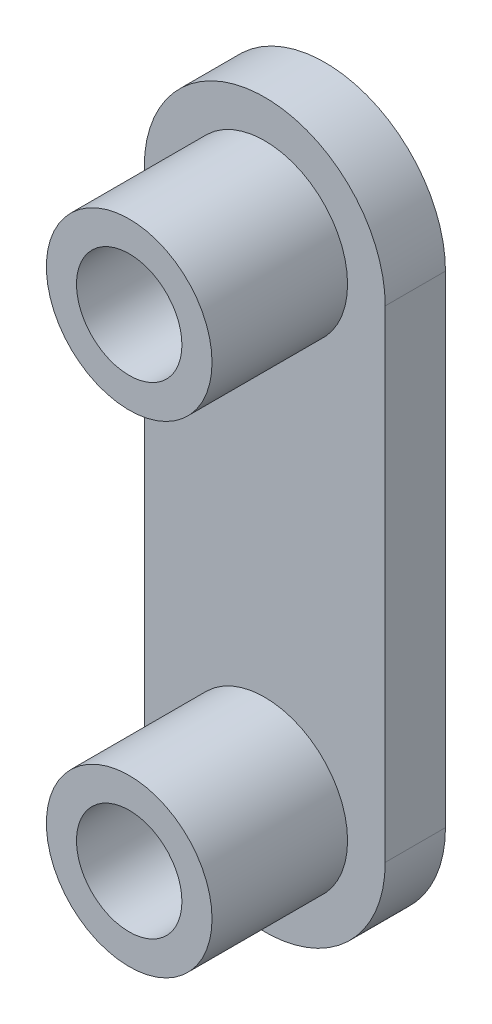
ISO-10303-21;
HEADER;
FILE_DESCRIPTION(('STEP AP214'),'2;1');
FILE_NAME('part.step','',(''),(''),'','','');
FILE_SCHEMA(('AUTOMOTIVE_DESIGN { 1 0 10303 214 1 1 1 1 }'));
ENDSEC;
DATA;
#1=APPLICATION_CONTEXT('core data for automotive mechanical design processes');
#2=APPLICATION_PROTOCOL_DEFINITION('international standard','automotive_design',2000,#1);
#3=PRODUCT_CONTEXT('',#1,'mechanical');
#4=PRODUCT('Part','Part','',(#3));
#5=PRODUCT_RELATED_PRODUCT_CATEGORY('part','',(#4));
#6=PRODUCT_DEFINITION_FORMATION('','',#4);
#7=PRODUCT_DEFINITION_CONTEXT('part definition',#1,'design');
#8=PRODUCT_DEFINITION('design','',#6,#7);
#9=PRODUCT_DEFINITION_SHAPE('','',#8);
#10=(LENGTH_UNIT() NAMED_UNIT(*) SI_UNIT(.MILLI.,.METRE.));
#11=(NAMED_UNIT(*) PLANE_ANGLE_UNIT() SI_UNIT($,.RADIAN.));
#12=(NAMED_UNIT(*) SI_UNIT($,.STERADIAN.) SOLID_ANGLE_UNIT());
#13=UNCERTAINTY_MEASURE_WITH_UNIT(LENGTH_MEASURE(1.E-05),#10,'distance_accuracy_value','');
#14=(GEOMETRIC_REPRESENTATION_CONTEXT(3) GLOBAL_UNCERTAINTY_ASSIGNED_CONTEXT((#13)) GLOBAL_UNIT_ASSIGNED_CONTEXT((#10,
#11,#12)) REPRESENTATION_CONTEXT('',''));
#15=CARTESIAN_POINT('',(0.,0.,0.));
#16=DIRECTION('',(0.,0.,1.));
#17=DIRECTION('',(1.,0.,0.));
#18=AXIS2_PLACEMENT_3D('',#15,#16,#17);
#19=CARTESIAN_POINT('',(4.,0.,-2.));
#20=DIRECTION('',(-1.,0.,0.));
#21=DIRECTION('',(0.,-1.,0.));
#22=AXIS2_PLACEMENT_3D('',#19,#20,#21);
#23=PLANE('',#22);
#24=DIRECTION('',(0.,-1.,0.));
#25=VECTOR('',#24,1.);
#26=CARTESIAN_POINT('',(4.,0.,0.));
#27=LINE('',#26,#25);
#28=CARTESIAN_POINT('',(4.,0.,0.));
#29=VERTEX_POINT('',#28);
#30=CARTESIAN_POINT('',(4.,-16.,0.));
#31=VERTEX_POINT('',#30);
#32=EDGE_CURVE('E143',#29,#31,#27,.T.);
#33=ORIENTED_EDGE('',*,*,#32,.T.);
#34=DIRECTION('',(0.,0.,1.));
#35=VECTOR('',#34,1.);
#36=CARTESIAN_POINT('',(4.,-16.,-2.));
#37=LINE('',#36,#35);
#38=CARTESIAN_POINT('',(4.,-16.,-2.));
#39=VERTEX_POINT('',#38);
#40=EDGE_CURVE('E112',#39,#31,#37,.T.);
#41=ORIENTED_EDGE('',*,*,#40,.F.);
#42=DIRECTION('',(0.,-1.,0.));
#43=VECTOR('',#42,1.);
#44=CARTESIAN_POINT('',(4.,0.,-2.));
#45=LINE('',#44,#43);
#46=CARTESIAN_POINT('',(4.,0.,-2.));
#47=VERTEX_POINT('',#46);
#48=EDGE_CURVE('E137',#47,#39,#45,.T.);
#49=ORIENTED_EDGE('',*,*,#48,.F.);
#50=DIRECTION('',(0.,0.,1.));
#51=VECTOR('',#50,1.);
#52=CARTESIAN_POINT('',(4.,0.,-2.));
#53=LINE('',#52,#51);
#54=EDGE_CURVE('E95',#47,#29,#53,.T.);
#55=ORIENTED_EDGE('',*,*,#54,.T.);
#56=EDGE_LOOP('',(#33,#41,#49,#55));
#57=FACE_BOUND('',#56,.T.);
#58=ADVANCED_FACE('F77',(#57),#23,.F.);
#59=CARTESIAN_POINT('',(-4.,0.,-2.));
#60=DIRECTION('',(-1.,0.,0.));
#61=DIRECTION('',(0.,-1.,0.));
#62=AXIS2_PLACEMENT_3D('',#59,#60,#61);
#63=PLANE('',#62);
#64=DIRECTION('',(0.,-1.,0.));
#65=VECTOR('',#64,1.);
#66=CARTESIAN_POINT('',(-4.,0.,0.));
#67=LINE('',#66,#65);
#68=CARTESIAN_POINT('',(-4.,0.,0.));
#69=VERTEX_POINT('',#68);
#70=CARTESIAN_POINT('',(-4.,-16.,0.));
#71=VERTEX_POINT('',#70);
#72=EDGE_CURVE('E148',#69,#71,#67,.T.);
#73=ORIENTED_EDGE('',*,*,#72,.F.);
#74=DIRECTION('',(0.,0.,1.));
#75=VECTOR('',#74,1.);
#76=CARTESIAN_POINT('',(-4.,0.,-2.));
#77=LINE('',#76,#75);
#78=CARTESIAN_POINT('',(-4.,0.,-2.));
#79=VERTEX_POINT('',#78);
#80=EDGE_CURVE('E123',#79,#69,#77,.T.);
#81=ORIENTED_EDGE('',*,*,#80,.F.);
#82=DIRECTION('',(0.,-1.,0.));
#83=VECTOR('',#82,1.);
#84=CARTESIAN_POINT('',(-4.,0.,-2.));
#85=LINE('',#84,#83);
#86=CARTESIAN_POINT('',(-4.,-16.,-2.));
#87=VERTEX_POINT('',#86);
#88=EDGE_CURVE('E136',#79,#87,#85,.T.);
#89=ORIENTED_EDGE('',*,*,#88,.T.);
#90=DIRECTION('',(0.,0.,1.));
#91=VECTOR('',#90,1.);
#92=CARTESIAN_POINT('',(-4.,-16.,-2.));
#93=LINE('',#92,#91);
#94=EDGE_CURVE('E125',#87,#71,#93,.T.);
#95=ORIENTED_EDGE('',*,*,#94,.T.);
#96=EDGE_LOOP('',(#73,#81,#89,#95));
#97=FACE_BOUND('',#96,.T.);
#98=ADVANCED_FACE('F141',(#97),#63,.T.);
#99=CARTESIAN_POINT('',(0.,0.,0.));
#100=DIRECTION('',(0.,0.,1.));
#101=DIRECTION('',(1.,0.,0.));
#102=AXIS2_PLACEMENT_3D('',#99,#100,#101);
#103=PLANE('',#102);
#104=CARTESIAN_POINT('',(0.,-16.,0.));
#105=DIRECTION('',(0.,0.,1.));
#106=DIRECTION('',(1.,0.,0.));
#107=AXIS2_PLACEMENT_3D('',#104,#105,#106);
#108=CIRCLE('',#107,2.75);
#109=CARTESIAN_POINT('',(2.75,-16.,0.));
#110=VERTEX_POINT('',#109);
#111=EDGE_CURVE('E315',#110,#110,#108,.T.);
#112=ORIENTED_EDGE('',*,*,#111,.F.);
#113=EDGE_LOOP('',(#112));
#114=FACE_BOUND('',#113,.T.);
#115=CARTESIAN_POINT('',(0.,0.,0.));
#116=DIRECTION('',(0.,0.,1.));
#117=DIRECTION('',(1.,0.,0.));
#118=AXIS2_PLACEMENT_3D('',#115,#116,#117);
#119=CIRCLE('',#118,2.75);
#120=CARTESIAN_POINT('',(2.75,0.,0.));
#121=VERTEX_POINT('',#120);
#122=EDGE_CURVE('E151',#121,#121,#119,.T.);
#123=ORIENTED_EDGE('',*,*,#122,.F.);
#124=EDGE_LOOP('',(#123));
#125=FACE_BOUND('',#124,.T.);
#126=ORIENTED_EDGE('',*,*,#32,.F.);
#127=CARTESIAN_POINT('',(0.,0.,0.));
#128=DIRECTION('',(0.,0.,1.));
#129=DIRECTION('',(1.,0.,0.));
#130=AXIS2_PLACEMENT_3D('',#127,#128,#129);
#131=CIRCLE('',#130,4.);
#132=EDGE_CURVE('E139',#29,#69,#131,.T.);
#133=ORIENTED_EDGE('',*,*,#132,.T.);
#134=ORIENTED_EDGE('',*,*,#72,.T.);
#135=CARTESIAN_POINT('',(0.,-16.,0.));
#136=DIRECTION('',(0.,0.,1.));
#137=DIRECTION('',(1.,0.,0.));
#138=AXIS2_PLACEMENT_3D('',#135,#136,#137);
#139=CIRCLE('',#138,4.);
#140=EDGE_CURVE('E129',#71,#31,#139,.T.);
#141=ORIENTED_EDGE('',*,*,#140,.T.);
#142=EDGE_LOOP('',(#126,#133,#134,#141));
#143=FACE_BOUND('',#142,.T.);
#144=ADVANCED_FACE('F181',(#114,#125,#143),#103,.T.);
#145=CARTESIAN_POINT('',(0.,0.,-2.));
#146=DIRECTION('',(0.,0.,1.));
#147=DIRECTION('',(1.,0.,0.));
#148=AXIS2_PLACEMENT_3D('',#145,#146,#147);
#149=PLANE('',#148);
#150=ORIENTED_EDGE('',*,*,#88,.F.);
#151=CARTESIAN_POINT('',(0.,0.,-2.));
#152=DIRECTION('',(0.,0.,1.));
#153=DIRECTION('',(1.,0.,0.));
#154=AXIS2_PLACEMENT_3D('',#151,#152,#153);
#155=CIRCLE('',#154,4.);
#156=EDGE_CURVE('E155',#47,#79,#155,.T.);
#157=ORIENTED_EDGE('',*,*,#156,.F.);
#158=ORIENTED_EDGE('',*,*,#48,.T.);
#159=CARTESIAN_POINT('',(0.,-16.,-2.));
#160=DIRECTION('',(0.,0.,1.));
#161=DIRECTION('',(1.,0.,0.));
#162=AXIS2_PLACEMENT_3D('',#159,#160,#161);
#163=CIRCLE('',#162,4.);
#164=EDGE_CURVE('E127',#87,#39,#163,.T.);
#165=ORIENTED_EDGE('',*,*,#164,.F.);
#166=EDGE_LOOP('',(#150,#157,#158,#165));
#167=FACE_BOUND('',#166,.T.);
#168=ADVANCED_FACE('F135',(#167),#149,.F.);
#169=CARTESIAN_POINT('',(0.,-16.,-2.));
#170=DIRECTION('',(0.,0.,1.));
#171=DIRECTION('',(1.,0.,0.));
#172=AXIS2_PLACEMENT_3D('',#169,#170,#171);
#173=CYLINDRICAL_SURFACE('',#172,4.);
#174=ORIENTED_EDGE('',*,*,#164,.T.);
#175=ORIENTED_EDGE('',*,*,#40,.T.);
#176=ORIENTED_EDGE('',*,*,#140,.F.);
#177=ORIENTED_EDGE('',*,*,#94,.F.);
#178=EDGE_LOOP('',(#174,#175,#176,#177));
#179=FACE_BOUND('',#178,.T.);
#180=ADVANCED_FACE('F79',(#179),#173,.T.);
#181=CARTESIAN_POINT('',(0.,0.,-2.));
#182=DIRECTION('',(0.,0.,1.));
#183=DIRECTION('',(1.,0.,0.));
#184=AXIS2_PLACEMENT_3D('',#181,#182,#183);
#185=CYLINDRICAL_SURFACE('',#184,4.);
#186=ORIENTED_EDGE('',*,*,#54,.F.);
#187=ORIENTED_EDGE('',*,*,#156,.T.);
#188=ORIENTED_EDGE('',*,*,#80,.T.);
#189=ORIENTED_EDGE('',*,*,#132,.F.);
#190=EDGE_LOOP('',(#186,#187,#188,#189));
#191=FACE_BOUND('',#190,.T.);
#192=ADVANCED_FACE('F200',(#191),#185,.T.);
#193=CARTESIAN_POINT('',(0.,0.,4.5));
#194=DIRECTION('',(0.,0.,-1.));
#195=DIRECTION('',(-1.,0.,0.));
#196=AXIS2_PLACEMENT_3D('',#193,#194,#195);
#197=CYLINDRICAL_SURFACE('',#196,2.75);
#198=CARTESIAN_POINT('',(0.,0.,4.5));
#199=DIRECTION('',(0.,0.,1.));
#200=DIRECTION('',(1.,0.,0.));
#201=AXIS2_PLACEMENT_3D('',#198,#199,#200);
#202=CIRCLE('',#201,2.75);
#203=CARTESIAN_POINT('',(2.75,0.,4.5));
#204=VERTEX_POINT('',#203);
#205=EDGE_CURVE('E314',#204,#204,#202,.T.);
#206=ORIENTED_EDGE('',*,*,#205,.F.);
#207=EDGE_LOOP('',(#206));
#208=FACE_BOUND('',#207,.T.);
#209=ORIENTED_EDGE('',*,*,#122,.T.);
#210=EDGE_LOOP('',(#209));
#211=FACE_BOUND('',#210,.T.);
#212=ADVANCED_FACE('F205',(#208,#211),#197,.T.);
#213=CARTESIAN_POINT('',(0.,0.,4.5));
#214=DIRECTION('',(0.,0.,-1.));
#215=DIRECTION('',(-1.,0.,0.));
#216=AXIS2_PLACEMENT_3D('',#213,#214,#215);
#217=CYLINDRICAL_SURFACE('',#216,1.75);
#218=CARTESIAN_POINT('',(0.,0.,4.5));
#219=DIRECTION('',(0.,0.,1.));
#220=DIRECTION('',(1.,0.,0.));
#221=AXIS2_PLACEMENT_3D('',#218,#219,#220);
#222=CIRCLE('',#221,1.75);
#223=CARTESIAN_POINT('',(1.75,0.,4.5));
#224=VERTEX_POINT('',#223);
#225=EDGE_CURVE('E169',#224,#224,#222,.T.);
#226=ORIENTED_EDGE('',*,*,#225,.T.);
#227=EDGE_LOOP('',(#226));
#228=FACE_BOUND('',#227,.T.);
#229=CARTESIAN_POINT('',(0.,0.,0.));
#230=DIRECTION('',(0.,0.,1.));
#231=DIRECTION('',(1.,0.,0.));
#232=AXIS2_PLACEMENT_3D('',#229,#230,#231);
#233=CIRCLE('',#232,1.75);
#234=CARTESIAN_POINT('',(1.75,0.,0.));
#235=VERTEX_POINT('',#234);
#236=EDGE_CURVE('E87',#235,#235,#233,.F.);
#237=ORIENTED_EDGE('',*,*,#236,.T.);
#238=EDGE_LOOP('',(#237));
#239=FACE_BOUND('',#238,.T.);
#240=ADVANCED_FACE('F174',(#228,#239),#217,.F.);
#241=CARTESIAN_POINT('',(0.,0.,4.5));
#242=DIRECTION('',(0.,0.,1.));
#243=DIRECTION('',(1.,0.,0.));
#244=AXIS2_PLACEMENT_3D('',#241,#242,#243);
#245=PLANE('',#244);
#246=ORIENTED_EDGE('',*,*,#205,.T.);
#247=EDGE_LOOP('',(#246));
#248=FACE_BOUND('',#247,.T.);
#249=ORIENTED_EDGE('',*,*,#225,.F.);
#250=EDGE_LOOP('',(#249));
#251=FACE_BOUND('',#250,.T.);
#252=ADVANCED_FACE('F179',(#248,#251),#245,.T.);
#253=ORIENTED_EDGE('',*,*,#236,.F.);
#254=EDGE_LOOP('',(#253));
#255=FACE_BOUND('',#254,.T.);
#256=ADVANCED_FACE('F176',(#255),#103,.T.);
#257=CARTESIAN_POINT('',(0.,-16.,4.5));
#258=DIRECTION('',(0.,0.,-1.));
#259=DIRECTION('',(-1.,0.,0.));
#260=AXIS2_PLACEMENT_3D('',#257,#258,#259);
#261=CYLINDRICAL_SURFACE('',#260,1.75);
#262=CARTESIAN_POINT('',(0.,-16.,4.5));
#263=DIRECTION('',(0.,0.,1.));
#264=DIRECTION('',(1.,0.,0.));
#265=AXIS2_PLACEMENT_3D('',#262,#263,#264);
#266=CIRCLE('',#265,1.75);
#267=CARTESIAN_POINT('',(1.75,-16.,4.5));
#268=VERTEX_POINT('',#267);
#269=EDGE_CURVE('E305',#268,#268,#266,.T.);
#270=ORIENTED_EDGE('',*,*,#269,.T.);
#271=EDGE_LOOP('',(#270));
#272=FACE_BOUND('',#271,.T.);
#273=CARTESIAN_POINT('',(0.,-16.,0.));
#274=DIRECTION('',(0.,0.,1.));
#275=DIRECTION('',(1.,0.,0.));
#276=AXIS2_PLACEMENT_3D('',#273,#274,#275);
#277=CIRCLE('',#276,1.75);
#278=CARTESIAN_POINT('',(1.75,-16.,0.));
#279=VERTEX_POINT('',#278);
#280=EDGE_CURVE('E12',#279,#279,#277,.F.);
#281=ORIENTED_EDGE('',*,*,#280,.T.);
#282=EDGE_LOOP('',(#281));
#283=FACE_BOUND('',#282,.T.);
#284=ADVANCED_FACE('F178',(#272,#283),#261,.F.);
#285=CARTESIAN_POINT('',(0.,-16.,4.5));
#286=DIRECTION('',(0.,0.,-1.));
#287=DIRECTION('',(-1.,0.,0.));
#288=AXIS2_PLACEMENT_3D('',#285,#286,#287);
#289=CYLINDRICAL_SURFACE('',#288,2.75);
#290=CARTESIAN_POINT('',(0.,-16.,4.5));
#291=DIRECTION('',(0.,0.,1.));
#292=DIRECTION('',(1.,0.,0.));
#293=AXIS2_PLACEMENT_3D('',#290,#291,#292);
#294=CIRCLE('',#293,2.75);
#295=CARTESIAN_POINT('',(2.75,-16.,4.5));
#296=VERTEX_POINT('',#295);
#297=EDGE_CURVE('E308',#296,#296,#294,.T.);
#298=ORIENTED_EDGE('',*,*,#297,.F.);
#299=EDGE_LOOP('',(#298));
#300=FACE_BOUND('',#299,.T.);
#301=ORIENTED_EDGE('',*,*,#111,.T.);
#302=EDGE_LOOP('',(#301));
#303=FACE_BOUND('',#302,.T.);
#304=ADVANCED_FACE('F187',(#300,#303),#289,.T.);
#305=CARTESIAN_POINT('',(0.,0.,4.5));
#306=DIRECTION('',(0.,0.,1.));
#307=DIRECTION('',(1.,0.,0.));
#308=AXIS2_PLACEMENT_3D('',#305,#306,#307);
#309=PLANE('',#308);
#310=ORIENTED_EDGE('',*,*,#269,.F.);
#311=EDGE_LOOP('',(#310));
#312=FACE_BOUND('',#311,.T.);
#313=ORIENTED_EDGE('',*,*,#297,.T.);
#314=EDGE_LOOP('',(#313));
#315=FACE_BOUND('',#314,.T.);
#316=ADVANCED_FACE('F197',(#312,#315),#309,.T.);
#317=ORIENTED_EDGE('',*,*,#280,.F.);
#318=EDGE_LOOP('',(#317));
#319=FACE_BOUND('',#318,.T.);
#320=ADVANCED_FACE('F182',(#319),#103,.T.);
#321=CLOSED_SHELL('',(#58,#98,#144,#168,#180,#192,#212,#240,#252,#256,#284,#304,#316,#320));
#322=MANIFOLD_SOLID_BREP('B2',#321);
#323=ADVANCED_BREP_SHAPE_REPRESENTATION('',(#18,#322),#14);
#324=SHAPE_DEFINITION_REPRESENTATION(#9,#323);
ENDSEC;
END-ISO-10303-21;
